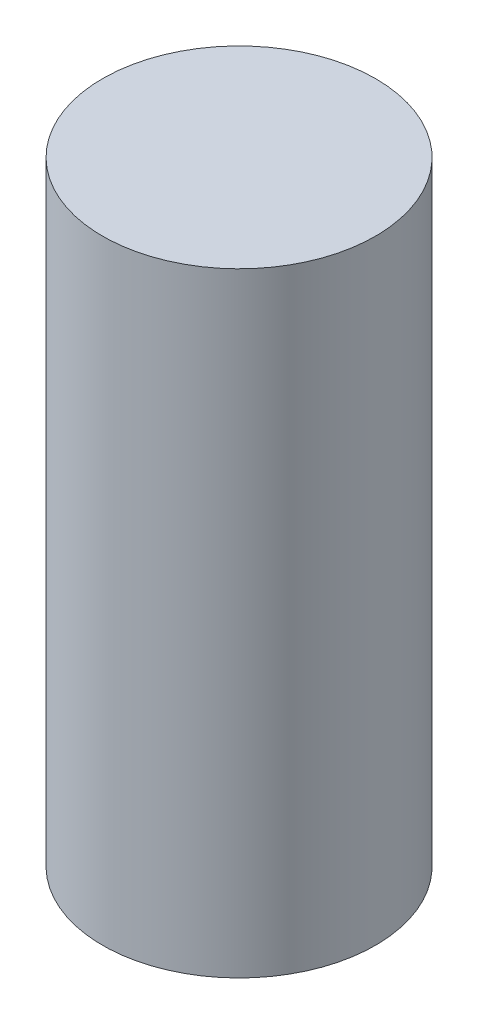
ISO-10303-21;
HEADER;
FILE_DESCRIPTION(('STEP AP214'),'2;1');
FILE_NAME('part.step','',(''),(''),'','','');
FILE_SCHEMA(('AUTOMOTIVE_DESIGN { 1 0 10303 214 1 1 1 1 }'));
ENDSEC;
DATA;
#1=APPLICATION_CONTEXT('core data for automotive mechanical design processes');
#2=APPLICATION_PROTOCOL_DEFINITION('international standard','automotive_design',2000,#1);
#3=PRODUCT_CONTEXT('',#1,'mechanical');
#4=PRODUCT('Part','Part','',(#3));
#5=PRODUCT_RELATED_PRODUCT_CATEGORY('part','',(#4));
#6=PRODUCT_DEFINITION_FORMATION('','',#4);
#7=PRODUCT_DEFINITION_CONTEXT('part definition',#1,'design');
#8=PRODUCT_DEFINITION('design','',#6,#7);
#9=PRODUCT_DEFINITION_SHAPE('','',#8);
#10=(LENGTH_UNIT() NAMED_UNIT(*) SI_UNIT(.MILLI.,.METRE.));
#11=(NAMED_UNIT(*) PLANE_ANGLE_UNIT() SI_UNIT($,.RADIAN.));
#12=(NAMED_UNIT(*) SI_UNIT($,.STERADIAN.) SOLID_ANGLE_UNIT());
#13=UNCERTAINTY_MEASURE_WITH_UNIT(LENGTH_MEASURE(1.E-05),#10,'distance_accuracy_value','');
#14=(GEOMETRIC_REPRESENTATION_CONTEXT(3) GLOBAL_UNCERTAINTY_ASSIGNED_CONTEXT((#13)) GLOBAL_UNIT_ASSIGNED_CONTEXT((#10,
#11,#12)) REPRESENTATION_CONTEXT('',''));
#15=CARTESIAN_POINT('',(0.,0.,0.));
#16=DIRECTION('',(0.,0.,1.));
#17=DIRECTION('',(1.,0.,0.));
#18=AXIS2_PLACEMENT_3D('',#15,#16,#17);
#19=CARTESIAN_POINT('',(0.,180.,0.));
#20=DIRECTION('',(0.,-1.,0.));
#21=DIRECTION('',(0.,0.,-1.));
#22=AXIS2_PLACEMENT_3D('',#19,#20,#21);
#23=CYLINDRICAL_SURFACE('',#22,40.);
#24=CARTESIAN_POINT('',(0.,180.,0.));
#25=DIRECTION('',(0.,1.,0.));
#26=DIRECTION('',(0.,0.,1.));
#27=AXIS2_PLACEMENT_3D('',#24,#25,#26);
#28=CIRCLE('',#27,40.);
#29=CARTESIAN_POINT('',(0.,180.,-40.));
#30=VERTEX_POINT('',#29);
#31=EDGE_CURVE('E10',#30,#30,#28,.T.);
#32=CARTESIAN_POINT('',(0.,0.,0.));
#33=DIRECTION('',(0.,1.,0.));
#34=DIRECTION('',(0.,0.,1.));
#35=AXIS2_PLACEMENT_3D('',#32,#33,#34);
#36=CIRCLE('',#35,40.);
#37=CARTESIAN_POINT('',(0.,0.,-40.));
#38=VERTEX_POINT('',#37);
#39=EDGE_CURVE('E42',#38,#38,#36,.T.);
#40=CARTESIAN_POINT('',(0.,180.,-40.));
#41=CARTESIAN_POINT('',(0.,178.125,-40.));
#42=CARTESIAN_POINT('',(0.,176.25,-40.));
#43=CARTESIAN_POINT('',(0.,172.5,-40.));
#44=CARTESIAN_POINT('',(0.,170.625,-40.));
#45=CARTESIAN_POINT('',(0.,166.875,-40.));
#46=CARTESIAN_POINT('',(0.,165.,-40.));
#47=CARTESIAN_POINT('',(0.,161.25,-40.));
#48=CARTESIAN_POINT('',(0.,159.375,-40.));
#49=CARTESIAN_POINT('',(0.,155.625,-40.));
#50=CARTESIAN_POINT('',(0.,153.75,-40.));
#51=CARTESIAN_POINT('',(0.,150.,-40.));
#52=CARTESIAN_POINT('',(0.,148.125,-40.));
#53=CARTESIAN_POINT('',(0.,144.375,-40.));
#54=CARTESIAN_POINT('',(0.,142.5,-40.));
#55=CARTESIAN_POINT('',(0.,138.75,-40.));
#56=CARTESIAN_POINT('',(0.,136.875,-40.));
#57=CARTESIAN_POINT('',(0.,133.125,-40.));
#58=CARTESIAN_POINT('',(0.,131.25,-40.));
#59=CARTESIAN_POINT('',(0.,127.5,-40.));
#60=CARTESIAN_POINT('',(0.,125.625,-40.));
#61=CARTESIAN_POINT('',(0.,121.875,-40.));
#62=CARTESIAN_POINT('',(0.,120.,-40.));
#63=CARTESIAN_POINT('',(0.,116.25,-40.));
#64=CARTESIAN_POINT('',(0.,114.375,-40.));
#65=CARTESIAN_POINT('',(0.,110.625,-40.));
#66=CARTESIAN_POINT('',(0.,108.75,-40.));
#67=CARTESIAN_POINT('',(0.,105.,-40.));
#68=CARTESIAN_POINT('',(0.,103.125,-40.));
#69=CARTESIAN_POINT('',(0.,99.375,-40.));
#70=CARTESIAN_POINT('',(0.,97.5,-40.));
#71=CARTESIAN_POINT('',(0.,93.75,-40.));
#72=CARTESIAN_POINT('',(0.,91.875,-40.));
#73=CARTESIAN_POINT('',(0.,88.125,-40.));
#74=CARTESIAN_POINT('',(0.,86.25,-40.));
#75=CARTESIAN_POINT('',(0.,82.5,-40.));
#76=CARTESIAN_POINT('',(0.,80.625,-40.));
#77=CARTESIAN_POINT('',(0.,76.875,-40.));
#78=CARTESIAN_POINT('',(0.,75.,-40.));
#79=CARTESIAN_POINT('',(0.,71.25,-40.));
#80=CARTESIAN_POINT('',(0.,69.375,-40.));
#81=CARTESIAN_POINT('',(0.,65.625,-40.));
#82=CARTESIAN_POINT('',(0.,63.75,-40.));
#83=CARTESIAN_POINT('',(0.,60.,-40.));
#84=CARTESIAN_POINT('',(0.,58.125,-40.));
#85=CARTESIAN_POINT('',(0.,54.375,-40.));
#86=CARTESIAN_POINT('',(0.,52.5,-40.));
#87=CARTESIAN_POINT('',(0.,48.75,-40.));
#88=CARTESIAN_POINT('',(0.,46.875,-40.));
#89=CARTESIAN_POINT('',(0.,43.125,-40.));
#90=CARTESIAN_POINT('',(0.,41.25,-40.));
#91=CARTESIAN_POINT('',(0.,37.5,-40.));
#92=CARTESIAN_POINT('',(0.,35.625,-40.));
#93=CARTESIAN_POINT('',(0.,31.875,-40.));
#94=CARTESIAN_POINT('',(0.,30.,-40.));
#95=CARTESIAN_POINT('',(0.,26.25,-40.));
#96=CARTESIAN_POINT('',(0.,24.375,-40.));
#97=CARTESIAN_POINT('',(0.,20.625,-40.));
#98=CARTESIAN_POINT('',(0.,18.75,-40.));
#99=CARTESIAN_POINT('',(0.,15.,-40.));
#100=CARTESIAN_POINT('',(0.,13.125,-40.));
#101=CARTESIAN_POINT('',(0.,9.37499999999998,-40.));
#102=CARTESIAN_POINT('',(0.,7.49999999999997,-40.));
#103=CARTESIAN_POINT('',(0.,3.74999999999997,-40.));
#104=CARTESIAN_POINT('',(0.,1.87499999999997,-40.));
#105=CARTESIAN_POINT('',(0.,0.,-40.));
#106=B_SPLINE_CURVE_WITH_KNOTS('',3,(#40,#41,#42,#43,#44,#45,#46,#47,#48,#49,#50,#51,#52,#53,
#54,#55,#56,#57,#58,#59,#60,#61,#62,#63,#64,#65,#66,#67,#68,#69,#70,#71,#72,#73,#74,#75,#76,#77,
#78,#79,#80,#81,#82,#83,#84,#85,#86,#87,#88,#89,#90,#91,#92,#93,#94,#95,#96,#97,#98,#99,#100,
#101,#102,#103,#104,#105),.UNSPECIFIED.,.F.,.F.,(4,2,2,2,2,2,2,2,2,2,2,2,2,2,2,2,2,2,2,2,2,2,2,
2,2,2,2,2,2,2,2,2,4),(0.,5.62500000000002,11.25,16.875,22.5,28.125,33.75,39.375,45.,50.625,
56.25,61.875,67.5,73.125,78.75,84.375,90.,95.625,101.25,106.875,112.5,118.125,123.75,129.375,
135.,140.625,146.25,151.875,157.5,163.125,168.75,174.375,180.),.UNSPECIFIED.);
#107=EDGE_CURVE('BSEAM39',#30,#38,#106,.T.);
#108=ORIENTED_EDGE('',*,*,#31,.F.);
#109=ORIENTED_EDGE('',*,*,#39,.T.);
#110=ORIENTED_EDGE('',*,*,#107,.T.);
#111=ORIENTED_EDGE('',*,*,#107,.F.);
#112=EDGE_LOOP('',(#108,#110,#109,#111));
#113=FACE_BOUND('',#112,.T.);
#114=ADVANCED_FACE('F39',(#113),#23,.T.);
#115=CARTESIAN_POINT('',(0.,180.,0.));
#116=DIRECTION('',(0.,1.,0.));
#117=DIRECTION('',(0.,0.,1.));
#118=AXIS2_PLACEMENT_3D('',#115,#116,#117);
#119=PLANE('',#118);
#120=ORIENTED_EDGE('',*,*,#31,.T.);
#121=EDGE_LOOP('',(#120));
#122=FACE_BOUND('',#121,.T.);
#123=ADVANCED_FACE('F56',(#122),#119,.T.);
#124=CARTESIAN_POINT('',(0.,0.,0.));
#125=DIRECTION('',(0.,1.,0.));
#126=DIRECTION('',(0.,0.,1.));
#127=AXIS2_PLACEMENT_3D('',#124,#125,#126);
#128=PLANE('',#127);
#129=ORIENTED_EDGE('',*,*,#39,.F.);
#130=EDGE_LOOP('',(#129));
#131=FACE_BOUND('',#130,.T.);
#132=ADVANCED_FACE('F54',(#131),#128,.F.);
#133=CLOSED_SHELL('',(#114,#123,#132));
#134=MANIFOLD_SOLID_BREP('B2',#133);
#135=ADVANCED_BREP_SHAPE_REPRESENTATION('',(#18,#134),#14);
#136=SHAPE_DEFINITION_REPRESENTATION(#9,#135);
ENDSEC;
END-ISO-10303-21;
